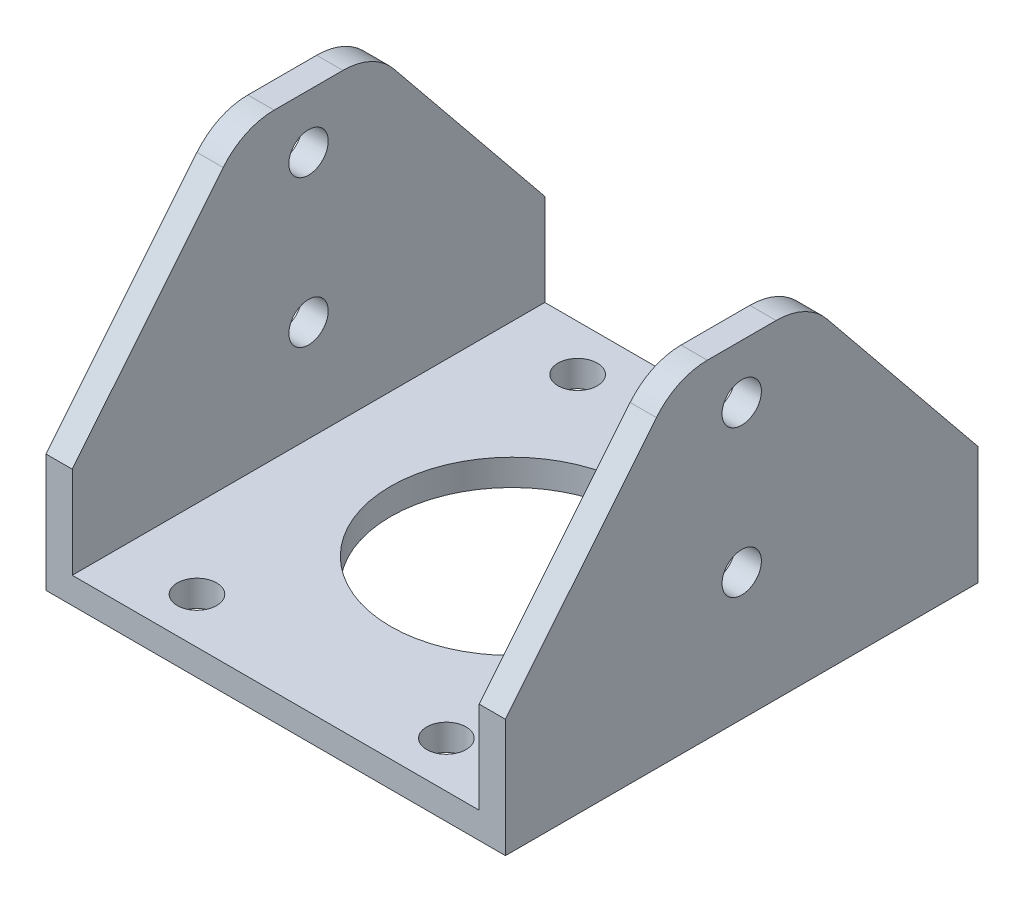
ISO-10303-21;
HEADER;
FILE_DESCRIPTION(('STEP AP214'),'2;1');
FILE_NAME('part.step','',(''),(''),'','','');
FILE_SCHEMA(('AUTOMOTIVE_DESIGN { 1 0 10303 214 1 1 1 1 }'));
ENDSEC;
DATA;
#1=APPLICATION_CONTEXT('core data for automotive mechanical design processes');
#2=APPLICATION_PROTOCOL_DEFINITION('international standard','automotive_design',2000,#1);
#3=PRODUCT_CONTEXT('',#1,'mechanical');
#4=PRODUCT('Part','Part','',(#3));
#5=PRODUCT_RELATED_PRODUCT_CATEGORY('part','',(#4));
#6=PRODUCT_DEFINITION_FORMATION('','',#4);
#7=PRODUCT_DEFINITION_CONTEXT('part definition',#1,'design');
#8=PRODUCT_DEFINITION('design','',#6,#7);
#9=PRODUCT_DEFINITION_SHAPE('','',#8);
#10=(LENGTH_UNIT() NAMED_UNIT(*) SI_UNIT(.MILLI.,.METRE.));
#11=(NAMED_UNIT(*) PLANE_ANGLE_UNIT() SI_UNIT($,.RADIAN.));
#12=(NAMED_UNIT(*) SI_UNIT($,.STERADIAN.) SOLID_ANGLE_UNIT());
#13=UNCERTAINTY_MEASURE_WITH_UNIT(LENGTH_MEASURE(1.E-05),#10,'distance_accuracy_value','');
#14=(GEOMETRIC_REPRESENTATION_CONTEXT(3) GLOBAL_UNCERTAINTY_ASSIGNED_CONTEXT((#13)) GLOBAL_UNIT_ASSIGNED_CONTEXT((#10,
#11,#12)) REPRESENTATION_CONTEXT('',''));
#15=CARTESIAN_POINT('',(0.,0.,0.));
#16=DIRECTION('',(0.,0.,1.));
#17=DIRECTION('',(1.,0.,0.));
#18=AXIS2_PLACEMENT_3D('',#15,#16,#17);
#19=CARTESIAN_POINT('',(35.,0.,36.));
#20=DIRECTION('',(0.,1.,0.));
#21=DIRECTION('',(-1.,0.,0.));
#22=AXIS2_PLACEMENT_3D('',#19,#20,#21);
#23=PLANE('',#22);
#24=CARTESIAN_POINT('',(27.,0.,3.5));
#25=DIRECTION('',(0.,1.,0.));
#26=DIRECTION('',(-1.,0.,0.));
#27=AXIS2_PLACEMENT_3D('',#24,#25,#26);
#28=CIRCLE('',#27,1.5);
#29=CARTESIAN_POINT('',(25.5,0.,3.5));
#30=VERTEX_POINT('',#29);
#31=EDGE_CURVE('E294',#30,#30,#28,.T.);
#32=ORIENTED_EDGE('',*,*,#31,.T.);
#33=EDGE_LOOP('',(#32));
#34=FACE_BOUND('',#33,.T.);
#35=CARTESIAN_POINT('',(8.00000000000001,0.,32.5));
#36=DIRECTION('',(0.,1.,0.));
#37=DIRECTION('',(-1.,0.,0.));
#38=AXIS2_PLACEMENT_3D('',#35,#36,#37);
#39=CIRCLE('',#38,1.5);
#40=CARTESIAN_POINT('',(6.5,0.,32.5));
#41=VERTEX_POINT('',#40);
#42=EDGE_CURVE('E291',#41,#41,#39,.T.);
#43=ORIENTED_EDGE('',*,*,#42,.T.);
#44=EDGE_LOOP('',(#43));
#45=FACE_BOUND('',#44,.T.);
#46=CARTESIAN_POINT('',(27.,0.,32.5));
#47=DIRECTION('',(0.,1.,0.));
#48=DIRECTION('',(-1.,0.,0.));
#49=AXIS2_PLACEMENT_3D('',#46,#47,#48);
#50=CIRCLE('',#49,1.5);
#51=CARTESIAN_POINT('',(25.5,0.,32.5));
#52=VERTEX_POINT('',#51);
#53=EDGE_CURVE('E288',#52,#52,#50,.T.);
#54=ORIENTED_EDGE('',*,*,#53,.T.);
#55=EDGE_LOOP('',(#54));
#56=FACE_BOUND('',#55,.T.);
#57=CARTESIAN_POINT('',(8.,0.,3.5));
#58=DIRECTION('',(0.,1.,0.));
#59=DIRECTION('',(-1.,0.,0.));
#60=AXIS2_PLACEMENT_3D('',#57,#58,#59);
#61=CIRCLE('',#60,1.5);
#62=CARTESIAN_POINT('',(6.5,0.,3.5));
#63=VERTEX_POINT('',#62);
#64=EDGE_CURVE('E285',#63,#63,#61,.T.);
#65=ORIENTED_EDGE('',*,*,#64,.T.);
#66=EDGE_LOOP('',(#65));
#67=FACE_BOUND('',#66,.T.);
#68=CARTESIAN_POINT('',(17.5,0.,18.));
#69=DIRECTION('',(0.,-1.,0.));
#70=DIRECTION('',(0.,0.,-1.));
#71=AXIS2_PLACEMENT_3D('',#68,#69,#70);
#72=CIRCLE('',#71,9.25);
#73=CARTESIAN_POINT('',(17.5,0.,8.75));
#74=VERTEX_POINT('',#73);
#75=EDGE_CURVE('E211',#74,#74,#72,.T.);
#76=ORIENTED_EDGE('',*,*,#75,.F.);
#77=EDGE_LOOP('',(#76));
#78=FACE_BOUND('',#77,.T.);
#79=DIRECTION('',(1.,0.,0.));
#80=VECTOR('',#79,1.);
#81=CARTESIAN_POINT('',(35.,0.,0.));
#82=LINE('',#81,#80);
#83=CARTESIAN_POINT('',(0.,0.,0.));
#84=VERTEX_POINT('',#83);
#85=CARTESIAN_POINT('',(35.,0.,0.));
#86=VERTEX_POINT('',#85);
#87=EDGE_CURVE('E176',#84,#86,#82,.T.);
#88=ORIENTED_EDGE('',*,*,#87,.T.);
#89=DIRECTION('',(0.,0.,-1.));
#90=VECTOR('',#89,1.);
#91=CARTESIAN_POINT('',(35.,0.,36.));
#92=LINE('',#91,#90);
#93=CARTESIAN_POINT('',(35.,0.,36.));
#94=VERTEX_POINT('',#93);
#95=EDGE_CURVE('E161',#94,#86,#92,.T.);
#96=ORIENTED_EDGE('',*,*,#95,.F.);
#97=DIRECTION('',(1.,0.,0.));
#98=VECTOR('',#97,1.);
#99=CARTESIAN_POINT('',(35.,0.,36.));
#100=LINE('',#99,#98);
#101=CARTESIAN_POINT('',(0.,0.,36.));
#102=VERTEX_POINT('',#101);
#103=EDGE_CURVE('E177',#102,#94,#100,.T.);
#104=ORIENTED_EDGE('',*,*,#103,.F.);
#105=DIRECTION('',(0.,0.,-1.));
#106=VECTOR('',#105,1.);
#107=CARTESIAN_POINT('',(0.,0.,36.));
#108=LINE('',#107,#106);
#109=EDGE_CURVE('E187',#102,#84,#108,.T.);
#110=ORIENTED_EDGE('',*,*,#109,.T.);
#111=EDGE_LOOP('',(#88,#96,#104,#110));
#112=FACE_BOUND('',#111,.T.);
#113=ADVANCED_FACE('F34',(#34,#45,#56,#67,#78,#112),#23,.F.);
#114=CARTESIAN_POINT('',(35.,25.,36.));
#115=DIRECTION('',(-1.,0.,0.));
#116=DIRECTION('',(0.,0.,1.));
#117=AXIS2_PLACEMENT_3D('',#114,#115,#116);
#118=PLANE('',#117);
#119=CARTESIAN_POINT('',(35.,20.9,18.));
#120=DIRECTION('',(-1.,0.,0.));
#121=DIRECTION('',(0.,0.,1.));
#122=AXIS2_PLACEMENT_3D('',#119,#120,#121);
#123=CIRCLE('',#122,1.5);
#124=CARTESIAN_POINT('',(35.,20.9,19.5));
#125=VERTEX_POINT('',#124);
#126=EDGE_CURVE('E318',#125,#125,#123,.T.);
#127=ORIENTED_EDGE('',*,*,#126,.T.);
#128=EDGE_LOOP('',(#127));
#129=FACE_BOUND('',#128,.T.);
#130=CARTESIAN_POINT('',(35.,9.7,18.));
#131=DIRECTION('',(-1.,0.,0.));
#132=DIRECTION('',(0.,0.,1.));
#133=AXIS2_PLACEMENT_3D('',#130,#131,#132);
#134=CIRCLE('',#133,1.5);
#135=CARTESIAN_POINT('',(35.,9.7,19.5));
#136=VERTEX_POINT('',#135);
#137=EDGE_CURVE('E309',#136,#136,#134,.T.);
#138=ORIENTED_EDGE('',*,*,#137,.T.);
#139=EDGE_LOOP('',(#138));
#140=FACE_BOUND('',#139,.T.);
#141=DIRECTION('',(0.,0.776114000116266,0.630592625094466));
#142=VECTOR('',#141,1.);
#143=CARTESIAN_POINT('',(35.,36.2564705882353,22.1458823529412));
#144=LINE('',#143,#142);
#145=CARTESIAN_POINT('',(35.,9.,0.));
#146=VERTEX_POINT('',#145);
#147=CARTESIAN_POINT('',(35.,23.1529631254723,11.4992825394463));
#148=VERTEX_POINT('',#147);
#149=EDGE_CURVE('E247',#146,#148,#144,.T.);
#150=ORIENTED_EDGE('',*,*,#149,.T.);
#151=CARTESIAN_POINT('',(35.,20.,15.3798525400276));
#152=DIRECTION('',(-1.,0.,0.));
#153=DIRECTION('',(0.,0.,1.));
#154=AXIS2_PLACEMENT_3D('',#151,#152,#153);
#155=CIRCLE('',#154,5.);
#156=CARTESIAN_POINT('',(35.,25.,15.3798525400276));
#157=VERTEX_POINT('',#156);
#158=EDGE_CURVE('E42',#148,#157,#155,.F.);
#159=ORIENTED_EDGE('',*,*,#158,.T.);
#160=DIRECTION('',(0.,0.,-1.));
#161=VECTOR('',#160,1.);
#162=CARTESIAN_POINT('',(35.,25.,36.));
#163=LINE('',#162,#161);
#164=CARTESIAN_POINT('',(35.,25.,20.6201474599724));
#165=VERTEX_POINT('',#164);
#166=EDGE_CURVE('E204',#165,#157,#163,.T.);
#167=ORIENTED_EDGE('',*,*,#166,.F.);
#168=CARTESIAN_POINT('',(35.,20.,20.6201474599724));
#169=DIRECTION('',(-1.,0.,0.));
#170=DIRECTION('',(0.,0.,1.));
#171=AXIS2_PLACEMENT_3D('',#168,#169,#170);
#172=CIRCLE('',#171,5.);
#173=CARTESIAN_POINT('',(35.,23.1529631254723,24.5007174605537));
#174=VERTEX_POINT('',#173);
#175=EDGE_CURVE('E49',#165,#174,#172,.F.);
#176=ORIENTED_EDGE('',*,*,#175,.T.);
#177=DIRECTION('',(0.,-0.776114000116266,0.630592625094466));
#178=VECTOR('',#177,1.);
#179=CARTESIAN_POINT('',(35.,18.6376470588235,28.1694117647059));
#180=LINE('',#179,#178);
#181=CARTESIAN_POINT('',(35.,9.00000000000001,36.));
#182=VERTEX_POINT('',#181);
#183=EDGE_CURVE('E271',#174,#182,#180,.T.);
#184=ORIENTED_EDGE('',*,*,#183,.T.);
#185=DIRECTION('',(0.,1.,0.));
#186=VECTOR('',#185,1.);
#187=CARTESIAN_POINT('',(35.,25.,36.));
#188=LINE('',#187,#186);
#189=EDGE_CURVE('E181',#94,#182,#188,.T.);
#190=ORIENTED_EDGE('',*,*,#189,.F.);
#191=ORIENTED_EDGE('',*,*,#95,.T.);
#192=DIRECTION('',(0.,1.,0.));
#193=VECTOR('',#192,1.);
#194=CARTESIAN_POINT('',(35.,25.,0.));
#195=LINE('',#194,#193);
#196=EDGE_CURVE('E334',#86,#146,#195,.T.);
#197=ORIENTED_EDGE('',*,*,#196,.T.);
#198=EDGE_LOOP('',(#150,#159,#167,#176,#184,#190,#191,#197));
#199=FACE_BOUND('',#198,.T.);
#200=ADVANCED_FACE('F245',(#129,#140,#199),#118,.F.);
#201=CARTESIAN_POINT('',(33.,25.,36.));
#202=DIRECTION('',(0.,-1.,0.));
#203=DIRECTION('',(0.,0.,-1.));
#204=AXIS2_PLACEMENT_3D('',#201,#202,#203);
#205=PLANE('',#204);
#206=ORIENTED_EDGE('',*,*,#166,.T.);
#207=DIRECTION('',(-1.,0.,0.));
#208=VECTOR('',#207,1.);
#209=CARTESIAN_POINT('',(33.,25.,15.3798525400276));
#210=LINE('',#209,#208);
#211=CARTESIAN_POINT('',(33.,25.,15.3798525400276));
#212=VERTEX_POINT('',#211);
#213=EDGE_CURVE('E236',#157,#212,#210,.T.);
#214=ORIENTED_EDGE('',*,*,#213,.T.);
#215=DIRECTION('',(0.,0.,-1.));
#216=VECTOR('',#215,1.);
#217=CARTESIAN_POINT('',(33.,25.,36.));
#218=LINE('',#217,#216);
#219=CARTESIAN_POINT('',(33.,25.,20.6201474599724));
#220=VERTEX_POINT('',#219);
#221=EDGE_CURVE('E201',#220,#212,#218,.T.);
#222=ORIENTED_EDGE('',*,*,#221,.F.);
#223=DIRECTION('',(-1.,0.,0.));
#224=VECTOR('',#223,1.);
#225=CARTESIAN_POINT('',(33.,25.,20.6201474599724));
#226=LINE('',#225,#224);
#227=EDGE_CURVE('E234',#220,#165,#226,.F.);
#228=ORIENTED_EDGE('',*,*,#227,.T.);
#229=EDGE_LOOP('',(#206,#214,#222,#228));
#230=FACE_BOUND('',#229,.T.);
#231=ADVANCED_FACE('F251',(#230),#205,.F.);
#232=CARTESIAN_POINT('',(33.,2.,36.));
#233=DIRECTION('',(1.,0.,0.));
#234=DIRECTION('',(0.,0.,-1.));
#235=AXIS2_PLACEMENT_3D('',#232,#233,#234);
#236=PLANE('',#235);
#237=CARTESIAN_POINT('',(33.,20.9,18.));
#238=DIRECTION('',(1.,0.,0.));
#239=DIRECTION('',(0.,0.,-1.));
#240=AXIS2_PLACEMENT_3D('',#237,#238,#239);
#241=CIRCLE('',#240,1.5);
#242=CARTESIAN_POINT('',(33.,20.9,16.5));
#243=VERTEX_POINT('',#242);
#244=EDGE_CURVE('E315',#243,#243,#241,.T.);
#245=ORIENTED_EDGE('',*,*,#244,.T.);
#246=EDGE_LOOP('',(#245));
#247=FACE_BOUND('',#246,.T.);
#248=CARTESIAN_POINT('',(33.,9.7,18.));
#249=DIRECTION('',(1.,0.,0.));
#250=DIRECTION('',(0.,0.,-1.));
#251=AXIS2_PLACEMENT_3D('',#248,#249,#250);
#252=CIRCLE('',#251,1.5);
#253=CARTESIAN_POINT('',(33.,9.7,16.5));
#254=VERTEX_POINT('',#253);
#255=EDGE_CURVE('E306',#254,#254,#252,.T.);
#256=ORIENTED_EDGE('',*,*,#255,.T.);
#257=EDGE_LOOP('',(#256));
#258=FACE_BOUND('',#257,.T.);
#259=ORIENTED_EDGE('',*,*,#221,.T.);
#260=CARTESIAN_POINT('',(33.,20.,15.3798525400276));
#261=DIRECTION('',(1.,0.,0.));
#262=DIRECTION('',(0.,0.,-1.));
#263=AXIS2_PLACEMENT_3D('',#260,#261,#262);
#264=CIRCLE('',#263,5.);
#265=CARTESIAN_POINT('',(33.,23.1529631254723,11.4992825394463));
#266=VERTEX_POINT('',#265);
#267=EDGE_CURVE('E241',#212,#266,#264,.F.);
#268=ORIENTED_EDGE('',*,*,#267,.T.);
#269=DIRECTION('',(0.,-0.776114000116266,-0.630592625094466));
#270=VECTOR('',#269,1.);
#271=CARTESIAN_POINT('',(33.,22.4023529411765,10.8894117647059));
#272=LINE('',#271,#270);
#273=CARTESIAN_POINT('',(33.,9.,0.));
#274=VERTEX_POINT('',#273);
#275=EDGE_CURVE('E257',#266,#274,#272,.T.);
#276=ORIENTED_EDGE('',*,*,#275,.T.);
#277=DIRECTION('',(0.,-1.,0.));
#278=VECTOR('',#277,1.);
#279=CARTESIAN_POINT('',(33.,2.,0.));
#280=LINE('',#279,#278);
#281=CARTESIAN_POINT('',(33.,2.,0.));
#282=VERTEX_POINT('',#281);
#283=EDGE_CURVE('E336',#274,#282,#280,.T.);
#284=ORIENTED_EDGE('',*,*,#283,.T.);
#285=DIRECTION('',(0.,0.,-1.));
#286=VECTOR('',#285,1.);
#287=CARTESIAN_POINT('',(33.,2.,36.));
#288=LINE('',#287,#286);
#289=CARTESIAN_POINT('',(33.,2.,36.));
#290=VERTEX_POINT('',#289);
#291=EDGE_CURVE('E198',#290,#282,#288,.T.);
#292=ORIENTED_EDGE('',*,*,#291,.F.);
#293=DIRECTION('',(0.,-1.,0.));
#294=VECTOR('',#293,1.);
#295=CARTESIAN_POINT('',(33.,2.,36.));
#296=LINE('',#295,#294);
#297=CARTESIAN_POINT('',(33.,9.00000000000001,36.));
#298=VERTEX_POINT('',#297);
#299=EDGE_CURVE('E325',#298,#290,#296,.T.);
#300=ORIENTED_EDGE('',*,*,#299,.F.);
#301=DIRECTION('',(0.,0.776114000116266,-0.630592625094466));
#302=VECTOR('',#301,1.);
#303=CARTESIAN_POINT('',(33.,4.78352941176471,39.4258823529412));
#304=LINE('',#303,#302);
#305=CARTESIAN_POINT('',(33.,23.1529631254723,24.5007174605537));
#306=VERTEX_POINT('',#305);
#307=EDGE_CURVE('E268',#298,#306,#304,.T.);
#308=ORIENTED_EDGE('',*,*,#307,.T.);
#309=CARTESIAN_POINT('',(33.,20.,20.6201474599724));
#310=DIRECTION('',(1.,0.,0.));
#311=DIRECTION('',(0.,0.,-1.));
#312=AXIS2_PLACEMENT_3D('',#309,#310,#311);
#313=CIRCLE('',#312,5.);
#314=EDGE_CURVE('E239',#306,#220,#313,.F.);
#315=ORIENTED_EDGE('',*,*,#314,.T.);
#316=EDGE_LOOP('',(#259,#268,#276,#284,#292,#300,#308,#315));
#317=FACE_BOUND('',#316,.T.);
#318=ADVANCED_FACE('F256',(#247,#258,#317),#236,.F.);
#319=CARTESIAN_POINT('',(2.,2.,36.));
#320=DIRECTION('',(0.,-1.,0.));
#321=DIRECTION('',(0.,0.,-1.));
#322=AXIS2_PLACEMENT_3D('',#319,#320,#321);
#323=PLANE('',#322);
#324=CARTESIAN_POINT('',(27.,2.,3.5));
#325=DIRECTION('',(0.,1.,0.));
#326=DIRECTION('',(-1.,0.,0.));
#327=AXIS2_PLACEMENT_3D('',#324,#325,#326);
#328=CIRCLE('',#327,1.5);
#329=CARTESIAN_POINT('',(25.5,2.,3.5));
#330=VERTEX_POINT('',#329);
#331=EDGE_CURVE('E277',#330,#330,#328,.T.);
#332=ORIENTED_EDGE('',*,*,#331,.F.);
#333=EDGE_LOOP('',(#332));
#334=FACE_BOUND('',#333,.T.);
#335=CARTESIAN_POINT('',(8.00000000000001,2.,32.5));
#336=DIRECTION('',(0.,1.,0.));
#337=DIRECTION('',(-1.,0.,0.));
#338=AXIS2_PLACEMENT_3D('',#335,#336,#337);
#339=CIRCLE('',#338,1.5);
#340=CARTESIAN_POINT('',(6.5,2.,32.5));
#341=VERTEX_POINT('',#340);
#342=EDGE_CURVE('E276',#341,#341,#339,.T.);
#343=ORIENTED_EDGE('',*,*,#342,.F.);
#344=EDGE_LOOP('',(#343));
#345=FACE_BOUND('',#344,.T.);
#346=CARTESIAN_POINT('',(27.,2.,32.5));
#347=DIRECTION('',(0.,1.,0.));
#348=DIRECTION('',(-1.,0.,0.));
#349=AXIS2_PLACEMENT_3D('',#346,#347,#348);
#350=CIRCLE('',#349,1.5);
#351=CARTESIAN_POINT('',(25.5,2.,32.5));
#352=VERTEX_POINT('',#351);
#353=EDGE_CURVE('E273',#352,#352,#350,.T.);
#354=ORIENTED_EDGE('',*,*,#353,.F.);
#355=EDGE_LOOP('',(#354));
#356=FACE_BOUND('',#355,.T.);
#357=CARTESIAN_POINT('',(8.,2.,3.5));
#358=DIRECTION('',(0.,1.,0.));
#359=DIRECTION('',(-1.,0.,0.));
#360=AXIS2_PLACEMENT_3D('',#357,#358,#359);
#361=CIRCLE('',#360,1.5);
#362=CARTESIAN_POINT('',(6.5,2.,3.5));
#363=VERTEX_POINT('',#362);
#364=EDGE_CURVE('E280',#363,#363,#361,.T.);
#365=ORIENTED_EDGE('',*,*,#364,.F.);
#366=EDGE_LOOP('',(#365));
#367=FACE_BOUND('',#366,.T.);
#368=CARTESIAN_POINT('',(17.5,2.,18.));
#369=DIRECTION('',(0.,-1.,0.));
#370=DIRECTION('',(0.,0.,-1.));
#371=AXIS2_PLACEMENT_3D('',#368,#369,#370);
#372=CIRCLE('',#371,9.25);
#373=CARTESIAN_POINT('',(17.5,2.,8.75));
#374=VERTEX_POINT('',#373);
#375=EDGE_CURVE('E209',#374,#374,#372,.T.);
#376=ORIENTED_EDGE('',*,*,#375,.T.);
#377=EDGE_LOOP('',(#376));
#378=FACE_BOUND('',#377,.T.);
#379=DIRECTION('',(-1.,0.,0.));
#380=VECTOR('',#379,1.);
#381=CARTESIAN_POINT('',(2.,2.,0.));
#382=LINE('',#381,#380);
#383=CARTESIAN_POINT('',(2.,2.,0.));
#384=VERTEX_POINT('',#383);
#385=EDGE_CURVE('E183',#282,#384,#382,.T.);
#386=ORIENTED_EDGE('',*,*,#385,.T.);
#387=DIRECTION('',(0.,0.,-1.));
#388=VECTOR('',#387,1.);
#389=CARTESIAN_POINT('',(2.,2.,36.));
#390=LINE('',#389,#388);
#391=CARTESIAN_POINT('',(2.,2.,36.));
#392=VERTEX_POINT('',#391);
#393=EDGE_CURVE('E195',#392,#384,#390,.T.);
#394=ORIENTED_EDGE('',*,*,#393,.F.);
#395=DIRECTION('',(-1.,0.,0.));
#396=VECTOR('',#395,1.);
#397=CARTESIAN_POINT('',(2.,2.,36.));
#398=LINE('',#397,#396);
#399=EDGE_CURVE('E327',#290,#392,#398,.T.);
#400=ORIENTED_EDGE('',*,*,#399,.F.);
#401=ORIENTED_EDGE('',*,*,#291,.T.);
#402=EDGE_LOOP('',(#386,#394,#400,#401));
#403=FACE_BOUND('',#402,.T.);
#404=ADVANCED_FACE('F340',(#334,#345,#356,#367,#378,#403),#323,.F.);
#405=CARTESIAN_POINT('',(2.,25.,36.));
#406=DIRECTION('',(-1.,0.,0.));
#407=DIRECTION('',(0.,-1.,0.));
#408=AXIS2_PLACEMENT_3D('',#405,#406,#407);
#409=PLANE('',#408);
#410=CARTESIAN_POINT('',(2.,20.9,18.));
#411=DIRECTION('',(-1.,0.,0.));
#412=DIRECTION('',(0.,-1.,0.));
#413=AXIS2_PLACEMENT_3D('',#410,#411,#412);
#414=CIRCLE('',#413,1.5);
#415=CARTESIAN_POINT('',(2.,19.4,18.));
#416=VERTEX_POINT('',#415);
#417=EDGE_CURVE('E312',#416,#416,#414,.T.);
#418=ORIENTED_EDGE('',*,*,#417,.T.);
#419=EDGE_LOOP('',(#418));
#420=FACE_BOUND('',#419,.T.);
#421=CARTESIAN_POINT('',(2.,9.7,18.));
#422=DIRECTION('',(-1.,0.,0.));
#423=DIRECTION('',(0.,-1.,0.));
#424=AXIS2_PLACEMENT_3D('',#421,#422,#423);
#425=CIRCLE('',#424,1.5);
#426=CARTESIAN_POINT('',(2.,8.2,18.));
#427=VERTEX_POINT('',#426);
#428=EDGE_CURVE('E301',#427,#427,#425,.T.);
#429=ORIENTED_EDGE('',*,*,#428,.T.);
#430=EDGE_LOOP('',(#429));
#431=FACE_BOUND('',#430,.T.);
#432=DIRECTION('',(0.,0.776114000116266,0.630592625094466));
#433=VECTOR('',#432,1.);
#434=CARTESIAN_POINT('',(2.,36.2564705882353,22.1458823529412));
#435=LINE('',#434,#433);
#436=CARTESIAN_POINT('',(2.,9.,0.));
#437=VERTEX_POINT('',#436);
#438=CARTESIAN_POINT('',(2.,23.1529631254723,11.4992825394463));
#439=VERTEX_POINT('',#438);
#440=EDGE_CURVE('E155',#437,#439,#435,.T.);
#441=ORIENTED_EDGE('',*,*,#440,.T.);
#442=CARTESIAN_POINT('',(2.,20.,15.3798525400276));
#443=DIRECTION('',(-1.,0.,0.));
#444=DIRECTION('',(0.,-1.,0.));
#445=AXIS2_PLACEMENT_3D('',#442,#443,#444);
#446=CIRCLE('',#445,5.);
#447=CARTESIAN_POINT('',(2.,25.,15.3798525400276));
#448=VERTEX_POINT('',#447);
#449=EDGE_CURVE('E229',#439,#448,#446,.F.);
#450=ORIENTED_EDGE('',*,*,#449,.T.);
#451=DIRECTION('',(0.,0.,-1.));
#452=VECTOR('',#451,1.);
#453=CARTESIAN_POINT('',(2.,25.,36.));
#454=LINE('',#453,#452);
#455=CARTESIAN_POINT('',(2.,25.,20.6201474599724));
#456=VERTEX_POINT('',#455);
#457=EDGE_CURVE('E192',#456,#448,#454,.T.);
#458=ORIENTED_EDGE('',*,*,#457,.F.);
#459=CARTESIAN_POINT('',(2.,20.,20.6201474599724));
#460=DIRECTION('',(-1.,0.,0.));
#461=DIRECTION('',(0.,-1.,0.));
#462=AXIS2_PLACEMENT_3D('',#459,#460,#461);
#463=CIRCLE('',#462,5.);
#464=CARTESIAN_POINT('',(2.,23.1529631254723,24.5007174605537));
#465=VERTEX_POINT('',#464);
#466=EDGE_CURVE('E227',#456,#465,#463,.F.);
#467=ORIENTED_EDGE('',*,*,#466,.T.);
#468=DIRECTION('',(0.,-0.776114000116266,0.630592625094466));
#469=VECTOR('',#468,1.);
#470=CARTESIAN_POINT('',(2.,18.6376470588235,28.1694117647059));
#471=LINE('',#470,#469);
#472=CARTESIAN_POINT('',(2.,9.00000000000001,36.));
#473=VERTEX_POINT('',#472);
#474=EDGE_CURVE('E262',#465,#473,#471,.T.);
#475=ORIENTED_EDGE('',*,*,#474,.T.);
#476=DIRECTION('',(0.,1.,0.));
#477=VECTOR('',#476,1.);
#478=CARTESIAN_POINT('',(2.,25.,36.));
#479=LINE('',#478,#477);
#480=EDGE_CURVE('E329',#392,#473,#479,.T.);
#481=ORIENTED_EDGE('',*,*,#480,.F.);
#482=ORIENTED_EDGE('',*,*,#393,.T.);
#483=DIRECTION('',(0.,1.,0.));
#484=VECTOR('',#483,1.);
#485=CARTESIAN_POINT('',(2.,25.,0.));
#486=LINE('',#485,#484);
#487=EDGE_CURVE('E178',#384,#437,#486,.T.);
#488=ORIENTED_EDGE('',*,*,#487,.T.);
#489=EDGE_LOOP('',(#441,#450,#458,#467,#475,#481,#482,#488));
#490=FACE_BOUND('',#489,.T.);
#491=ADVANCED_FACE('F345',(#420,#431,#490),#409,.F.);
#492=CARTESIAN_POINT('',(0.,25.,36.));
#493=DIRECTION('',(0.,-1.,0.));
#494=DIRECTION('',(0.,0.,-1.));
#495=AXIS2_PLACEMENT_3D('',#492,#493,#494);
#496=PLANE('',#495);
#497=ORIENTED_EDGE('',*,*,#457,.T.);
#498=DIRECTION('',(-1.,0.,0.));
#499=VECTOR('',#498,1.);
#500=CARTESIAN_POINT('',(0.,25.,15.3798525400276));
#501=LINE('',#500,#499);
#502=CARTESIAN_POINT('',(0.,25.,15.3798525400276));
#503=VERTEX_POINT('',#502);
#504=EDGE_CURVE('E219',#448,#503,#501,.T.);
#505=ORIENTED_EDGE('',*,*,#504,.T.);
#506=DIRECTION('',(0.,0.,-1.));
#507=VECTOR('',#506,1.);
#508=CARTESIAN_POINT('',(0.,25.,36.));
#509=LINE('',#508,#507);
#510=CARTESIAN_POINT('',(0.,25.,20.6201474599724));
#511=VERTEX_POINT('',#510);
#512=EDGE_CURVE('E189',#511,#503,#509,.T.);
#513=ORIENTED_EDGE('',*,*,#512,.F.);
#514=DIRECTION('',(-1.,0.,0.));
#515=VECTOR('',#514,1.);
#516=CARTESIAN_POINT('',(0.,25.,20.6201474599724));
#517=LINE('',#516,#515);
#518=EDGE_CURVE('E217',#511,#456,#517,.F.);
#519=ORIENTED_EDGE('',*,*,#518,.T.);
#520=EDGE_LOOP('',(#497,#505,#513,#519));
#521=FACE_BOUND('',#520,.T.);
#522=ADVANCED_FACE('F368',(#521),#496,.F.);
#523=CARTESIAN_POINT('',(0.,0.,36.));
#524=DIRECTION('',(1.,0.,0.));
#525=DIRECTION('',(0.,0.,-1.));
#526=AXIS2_PLACEMENT_3D('',#523,#524,#525);
#527=PLANE('',#526);
#528=CARTESIAN_POINT('',(0.,20.9,18.));
#529=DIRECTION('',(-1.,0.,0.));
#530=DIRECTION('',(0.,0.,1.));
#531=AXIS2_PLACEMENT_3D('',#528,#529,#530);
#532=CIRCLE('',#531,1.5);
#533=CARTESIAN_POINT('',(0.,20.9,19.5));
#534=VERTEX_POINT('',#533);
#535=EDGE_CURVE('E298',#534,#534,#532,.T.);
#536=ORIENTED_EDGE('',*,*,#535,.F.);
#537=EDGE_LOOP('',(#536));
#538=FACE_BOUND('',#537,.T.);
#539=CARTESIAN_POINT('',(0.,9.7,18.));
#540=DIRECTION('',(-1.,0.,0.));
#541=DIRECTION('',(0.,0.,1.));
#542=AXIS2_PLACEMENT_3D('',#539,#540,#541);
#543=CIRCLE('',#542,1.5);
#544=CARTESIAN_POINT('',(0.,9.7,19.5));
#545=VERTEX_POINT('',#544);
#546=EDGE_CURVE('E297',#545,#545,#543,.T.);
#547=ORIENTED_EDGE('',*,*,#546,.F.);
#548=EDGE_LOOP('',(#547));
#549=FACE_BOUND('',#548,.T.);
#550=ORIENTED_EDGE('',*,*,#512,.T.);
#551=CARTESIAN_POINT('',(0.,20.,15.3798525400276));
#552=DIRECTION('',(1.,0.,0.));
#553=DIRECTION('',(0.,0.,-1.));
#554=AXIS2_PLACEMENT_3D('',#551,#552,#553);
#555=CIRCLE('',#554,5.);
#556=CARTESIAN_POINT('',(0.,23.1529631254723,11.4992825394463));
#557=VERTEX_POINT('',#556);
#558=EDGE_CURVE('E169',#503,#557,#555,.F.);
#559=ORIENTED_EDGE('',*,*,#558,.T.);
#560=DIRECTION('',(0.,0.776114000116266,0.630592625094466));
#561=VECTOR('',#560,1.);
#562=CARTESIAN_POINT('',(0.,9.,0.));
#563=LINE('',#562,#561);
#564=CARTESIAN_POINT('',(0.,9.,0.));
#565=VERTEX_POINT('',#564);
#566=EDGE_CURVE('E152',#565,#557,#563,.T.);
#567=ORIENTED_EDGE('',*,*,#566,.F.);
#568=DIRECTION('',(0.,-1.,0.));
#569=VECTOR('',#568,1.);
#570=CARTESIAN_POINT('',(0.,0.,0.));
#571=LINE('',#570,#569);
#572=EDGE_CURVE('E167',#565,#84,#571,.T.);
#573=ORIENTED_EDGE('',*,*,#572,.T.);
#574=ORIENTED_EDGE('',*,*,#109,.F.);
#575=DIRECTION('',(0.,-1.,0.));
#576=VECTOR('',#575,1.);
#577=CARTESIAN_POINT('',(0.,0.,36.));
#578=LINE('',#577,#576);
#579=CARTESIAN_POINT('',(0.,9.00000000000001,36.));
#580=VERTEX_POINT('',#579);
#581=EDGE_CURVE('E190',#580,#102,#578,.T.);
#582=ORIENTED_EDGE('',*,*,#581,.F.);
#583=DIRECTION('',(0.,-0.776114000116265,0.630592625094466));
#584=VECTOR('',#583,1.);
#585=CARTESIAN_POINT('',(0.,9.00000000000001,36.));
#586=LINE('',#585,#584);
#587=CARTESIAN_POINT('',(0.,23.1529631254723,24.5007174605537));
#588=VERTEX_POINT('',#587);
#589=EDGE_CURVE('E170',#588,#580,#586,.T.);
#590=ORIENTED_EDGE('',*,*,#589,.F.);
#591=CARTESIAN_POINT('',(0.,20.,20.6201474599724));
#592=DIRECTION('',(1.,0.,0.));
#593=DIRECTION('',(0.,0.,-1.));
#594=AXIS2_PLACEMENT_3D('',#591,#592,#593);
#595=CIRCLE('',#594,5.);
#596=EDGE_CURVE('E222',#588,#511,#595,.F.);
#597=ORIENTED_EDGE('',*,*,#596,.T.);
#598=EDGE_LOOP('',(#550,#559,#567,#573,#574,#582,#590,#597));
#599=FACE_BOUND('',#598,.T.);
#600=ADVANCED_FACE('F165',(#538,#549,#599),#527,.F.);
#601=CARTESIAN_POINT('',(0.,0.,36.));
#602=DIRECTION('',(0.,0.,-1.));
#603=DIRECTION('',(-1.,0.,0.));
#604=AXIS2_PLACEMENT_3D('',#601,#602,#603);
#605=PLANE('',#604);
#606=ORIENTED_EDGE('',*,*,#189,.T.);
#607=DIRECTION('',(-1.,0.,0.));
#608=VECTOR('',#607,1.);
#609=CARTESIAN_POINT('',(0.,9.00000000000001,36.));
#610=LINE('',#609,#608);
#611=EDGE_CURVE('E216',#182,#298,#610,.T.);
#612=ORIENTED_EDGE('',*,*,#611,.T.);
#613=ORIENTED_EDGE('',*,*,#299,.T.);
#614=ORIENTED_EDGE('',*,*,#399,.T.);
#615=ORIENTED_EDGE('',*,*,#480,.T.);
#616=EDGE_CURVE('E213',#473,#580,#610,.T.);
#617=ORIENTED_EDGE('',*,*,#616,.T.);
#618=ORIENTED_EDGE('',*,*,#581,.T.);
#619=ORIENTED_EDGE('',*,*,#103,.T.);
#620=EDGE_LOOP('',(#606,#612,#613,#614,#615,#617,#618,#619));
#621=FACE_BOUND('',#620,.T.);
#622=ADVANCED_FACE('F349',(#621),#605,.F.);
#623=CARTESIAN_POINT('',(0.,0.,0.));
#624=DIRECTION('',(0.,0.,-1.));
#625=DIRECTION('',(-1.,0.,0.));
#626=AXIS2_PLACEMENT_3D('',#623,#624,#625);
#627=PLANE('',#626);
#628=DIRECTION('',(-1.,0.,0.));
#629=VECTOR('',#628,1.);
#630=CARTESIAN_POINT('',(0.,9.,0.));
#631=LINE('',#630,#629);
#632=EDGE_CURVE('E160',#146,#274,#631,.T.);
#633=ORIENTED_EDGE('',*,*,#632,.F.);
#634=ORIENTED_EDGE('',*,*,#196,.F.);
#635=ORIENTED_EDGE('',*,*,#87,.F.);
#636=ORIENTED_EDGE('',*,*,#572,.F.);
#637=EDGE_CURVE('E149',#437,#565,#631,.T.);
#638=ORIENTED_EDGE('',*,*,#637,.F.);
#639=ORIENTED_EDGE('',*,*,#487,.F.);
#640=ORIENTED_EDGE('',*,*,#385,.F.);
#641=ORIENTED_EDGE('',*,*,#283,.F.);
#642=EDGE_LOOP('',(#633,#634,#635,#636,#638,#639,#640,#641));
#643=FACE_BOUND('',#642,.T.);
#644=ADVANCED_FACE('F174',(#643),#627,.T.);
#645=CARTESIAN_POINT('',(17.5,12.,18.));
#646=DIRECTION('',(0.,-1.,0.));
#647=DIRECTION('',(0.,0.,-1.));
#648=AXIS2_PLACEMENT_3D('',#645,#646,#647);
#649=CYLINDRICAL_SURFACE('',#648,9.25);
#650=ORIENTED_EDGE('',*,*,#75,.T.);
#651=EDGE_LOOP('',(#650));
#652=FACE_BOUND('',#651,.T.);
#653=ORIENTED_EDGE('',*,*,#375,.F.);
#654=EDGE_LOOP('',(#653));
#655=FACE_BOUND('',#654,.T.);
#656=ADVANCED_FACE('F411',(#652,#655),#649,.F.);
#657=CARTESIAN_POINT('',(54.,9.7,18.));
#658=DIRECTION('',(-1.,0.,0.));
#659=DIRECTION('',(0.,0.,1.));
#660=AXIS2_PLACEMENT_3D('',#657,#658,#659);
#661=CYLINDRICAL_SURFACE('',#660,1.5);
#662=ORIENTED_EDGE('',*,*,#546,.T.);
#663=EDGE_LOOP('',(#662));
#664=FACE_BOUND('',#663,.T.);
#665=ORIENTED_EDGE('',*,*,#428,.F.);
#666=EDGE_LOOP('',(#665));
#667=FACE_BOUND('',#666,.T.);
#668=ADVANCED_FACE('F416',(#664,#667),#661,.F.);
#669=CARTESIAN_POINT('',(54.,20.9,18.));
#670=DIRECTION('',(-1.,0.,0.));
#671=DIRECTION('',(0.,0.,1.));
#672=AXIS2_PLACEMENT_3D('',#669,#670,#671);
#673=CYLINDRICAL_SURFACE('',#672,1.5);
#674=ORIENTED_EDGE('',*,*,#535,.T.);
#675=EDGE_LOOP('',(#674));
#676=FACE_BOUND('',#675,.T.);
#677=ORIENTED_EDGE('',*,*,#417,.F.);
#678=EDGE_LOOP('',(#677));
#679=FACE_BOUND('',#678,.T.);
#680=ADVANCED_FACE('F422',(#676,#679),#673,.F.);
#681=ORIENTED_EDGE('',*,*,#255,.F.);
#682=EDGE_LOOP('',(#681));
#683=FACE_BOUND('',#682,.T.);
#684=ORIENTED_EDGE('',*,*,#137,.F.);
#685=EDGE_LOOP('',(#684));
#686=FACE_BOUND('',#685,.T.);
#687=ADVANCED_FACE('F418',(#683,#686),#661,.F.);
#688=ORIENTED_EDGE('',*,*,#244,.F.);
#689=EDGE_LOOP('',(#688));
#690=FACE_BOUND('',#689,.T.);
#691=ORIENTED_EDGE('',*,*,#126,.F.);
#692=EDGE_LOOP('',(#691));
#693=FACE_BOUND('',#692,.T.);
#694=ADVANCED_FACE('F421',(#690,#693),#673,.F.);
#695=CARTESIAN_POINT('',(8.,-8.,3.5));
#696=DIRECTION('',(0.,1.,0.));
#697=DIRECTION('',(-1.,0.,0.));
#698=AXIS2_PLACEMENT_3D('',#695,#696,#697);
#699=CYLINDRICAL_SURFACE('',#698,1.5);
#700=ORIENTED_EDGE('',*,*,#364,.T.);
#701=EDGE_LOOP('',(#700));
#702=FACE_BOUND('',#701,.T.);
#703=ORIENTED_EDGE('',*,*,#64,.F.);
#704=EDGE_LOOP('',(#703));
#705=FACE_BOUND('',#704,.T.);
#706=ADVANCED_FACE('F426',(#702,#705),#699,.F.);
#707=CARTESIAN_POINT('',(27.,-8.,32.5));
#708=DIRECTION('',(0.,1.,0.));
#709=DIRECTION('',(-1.,0.,0.));
#710=AXIS2_PLACEMENT_3D('',#707,#708,#709);
#711=CYLINDRICAL_SURFACE('',#710,1.5);
#712=ORIENTED_EDGE('',*,*,#353,.T.);
#713=EDGE_LOOP('',(#712));
#714=FACE_BOUND('',#713,.T.);
#715=ORIENTED_EDGE('',*,*,#53,.F.);
#716=EDGE_LOOP('',(#715));
#717=FACE_BOUND('',#716,.T.);
#718=ADVANCED_FACE('F430',(#714,#717),#711,.F.);
#719=CARTESIAN_POINT('',(8.00000000000001,-8.,32.5));
#720=DIRECTION('',(0.,1.,0.));
#721=DIRECTION('',(-1.,0.,0.));
#722=AXIS2_PLACEMENT_3D('',#719,#720,#721);
#723=CYLINDRICAL_SURFACE('',#722,1.5);
#724=ORIENTED_EDGE('',*,*,#342,.T.);
#725=EDGE_LOOP('',(#724));
#726=FACE_BOUND('',#725,.T.);
#727=ORIENTED_EDGE('',*,*,#42,.F.);
#728=EDGE_LOOP('',(#727));
#729=FACE_BOUND('',#728,.T.);
#730=ADVANCED_FACE('F432',(#726,#729),#723,.F.);
#731=CARTESIAN_POINT('',(27.,-8.,3.5));
#732=DIRECTION('',(0.,1.,0.));
#733=DIRECTION('',(-1.,0.,0.));
#734=AXIS2_PLACEMENT_3D('',#731,#732,#733);
#735=CYLINDRICAL_SURFACE('',#734,1.5);
#736=ORIENTED_EDGE('',*,*,#331,.T.);
#737=EDGE_LOOP('',(#736));
#738=FACE_BOUND('',#737,.T.);
#739=ORIENTED_EDGE('',*,*,#31,.F.);
#740=EDGE_LOOP('',(#739));
#741=FACE_BOUND('',#740,.T.);
#742=ADVANCED_FACE('F435',(#738,#741),#735,.F.);
#743=CARTESIAN_POINT('',(57.,9.,0.));
#744=DIRECTION('',(0.,-0.630592625094465,0.776114000116266));
#745=DIRECTION('',(0.,-0.776114000116266,-0.630592625094466));
#746=AXIS2_PLACEMENT_3D('',#743,#744,#745);
#747=PLANE('',#746);
#748=ORIENTED_EDGE('',*,*,#566,.T.);
#749=DIRECTION('',(-1.,0.,0.));
#750=VECTOR('',#749,1.);
#751=CARTESIAN_POINT('',(57.,23.1529631254723,11.4992825394463));
#752=LINE('',#751,#750);
#753=EDGE_CURVE('E225',#557,#439,#752,.F.);
#754=ORIENTED_EDGE('',*,*,#753,.T.);
#755=ORIENTED_EDGE('',*,*,#440,.F.);
#756=ORIENTED_EDGE('',*,*,#637,.T.);
#757=EDGE_LOOP('',(#748,#754,#755,#756));
#758=FACE_BOUND('',#757,.T.);
#759=ADVANCED_FACE('F151',(#758),#747,.F.);
#760=ORIENTED_EDGE('',*,*,#275,.F.);
#761=DIRECTION('',(-1.,0.,0.));
#762=VECTOR('',#761,1.);
#763=CARTESIAN_POINT('',(57.,23.1529631254723,11.4992825394463));
#764=LINE('',#763,#762);
#765=EDGE_CURVE('E57',#266,#148,#764,.F.);
#766=ORIENTED_EDGE('',*,*,#765,.T.);
#767=ORIENTED_EDGE('',*,*,#149,.F.);
#768=ORIENTED_EDGE('',*,*,#632,.T.);
#769=EDGE_LOOP('',(#760,#766,#767,#768));
#770=FACE_BOUND('',#769,.T.);
#771=ADVANCED_FACE('F259',(#770),#747,.F.);
#772=CARTESIAN_POINT('',(57.,9.00000000000001,36.));
#773=DIRECTION('',(0.,-0.630592625094466,-0.776114000116265));
#774=DIRECTION('',(0.,0.776114000116266,-0.630592625094466));
#775=AXIS2_PLACEMENT_3D('',#772,#773,#774);
#776=PLANE('',#775);
#777=ORIENTED_EDGE('',*,*,#474,.F.);
#778=DIRECTION('',(-1.,0.,0.));
#779=VECTOR('',#778,1.);
#780=CARTESIAN_POINT('',(57.,23.1529631254723,24.5007174605537));
#781=LINE('',#780,#779);
#782=EDGE_CURVE('E231',#465,#588,#781,.T.);
#783=ORIENTED_EDGE('',*,*,#782,.T.);
#784=ORIENTED_EDGE('',*,*,#589,.T.);
#785=ORIENTED_EDGE('',*,*,#616,.F.);
#786=EDGE_LOOP('',(#777,#783,#784,#785));
#787=FACE_BOUND('',#786,.T.);
#788=ADVANCED_FACE('F360',(#787),#776,.F.);
#789=ORIENTED_EDGE('',*,*,#183,.F.);
#790=DIRECTION('',(-1.,0.,0.));
#791=VECTOR('',#790,1.);
#792=CARTESIAN_POINT('',(57.,23.1529631254723,24.5007174605537));
#793=LINE('',#792,#791);
#794=EDGE_CURVE('E11',#174,#306,#793,.T.);
#795=ORIENTED_EDGE('',*,*,#794,.T.);
#796=ORIENTED_EDGE('',*,*,#307,.F.);
#797=ORIENTED_EDGE('',*,*,#611,.F.);
#798=EDGE_LOOP('',(#789,#795,#796,#797));
#799=FACE_BOUND('',#798,.T.);
#800=ADVANCED_FACE('F374',(#799),#776,.F.);
#801=CARTESIAN_POINT('',(0.,20.,15.3798525400276));
#802=DIRECTION('',(-1.,0.,0.));
#803=DIRECTION('',(0.,0.,1.));
#804=AXIS2_PLACEMENT_3D('',#801,#802,#803);
#805=CYLINDRICAL_SURFACE('',#804,5.);
#806=ORIENTED_EDGE('',*,*,#449,.F.);
#807=ORIENTED_EDGE('',*,*,#753,.F.);
#808=ORIENTED_EDGE('',*,*,#558,.F.);
#809=ORIENTED_EDGE('',*,*,#504,.F.);
#810=EDGE_LOOP('',(#806,#807,#808,#809));
#811=FACE_BOUND('',#810,.T.);
#812=ADVANCED_FACE('F372',(#811),#805,.T.);
#813=CARTESIAN_POINT('',(57.,20.,20.6201474599724));
#814=DIRECTION('',(-1.,0.,0.));
#815=DIRECTION('',(0.,0.,1.));
#816=AXIS2_PLACEMENT_3D('',#813,#814,#815);
#817=CYLINDRICAL_SURFACE('',#816,5.);
#818=ORIENTED_EDGE('',*,*,#466,.F.);
#819=ORIENTED_EDGE('',*,*,#518,.F.);
#820=ORIENTED_EDGE('',*,*,#596,.F.);
#821=ORIENTED_EDGE('',*,*,#782,.F.);
#822=EDGE_LOOP('',(#818,#819,#820,#821));
#823=FACE_BOUND('',#822,.T.);
#824=ADVANCED_FACE('F364',(#823),#817,.T.);
#825=CARTESIAN_POINT('',(33.,20.,15.3798525400276));
#826=DIRECTION('',(-1.,0.,0.));
#827=DIRECTION('',(0.,0.,1.));
#828=AXIS2_PLACEMENT_3D('',#825,#826,#827);
#829=CYLINDRICAL_SURFACE('',#828,5.);
#830=ORIENTED_EDGE('',*,*,#158,.F.);
#831=ORIENTED_EDGE('',*,*,#765,.F.);
#832=ORIENTED_EDGE('',*,*,#267,.F.);
#833=ORIENTED_EDGE('',*,*,#213,.F.);
#834=EDGE_LOOP('',(#830,#831,#832,#833));
#835=FACE_BOUND('',#834,.T.);
#836=ADVANCED_FACE('F254',(#835),#829,.T.);
#837=CARTESIAN_POINT('',(57.,20.,20.6201474599724));
#838=DIRECTION('',(-1.,0.,0.));
#839=DIRECTION('',(0.,0.,1.));
#840=AXIS2_PLACEMENT_3D('',#837,#838,#839);
#841=CYLINDRICAL_SURFACE('',#840,5.);
#842=ORIENTED_EDGE('',*,*,#175,.F.);
#843=ORIENTED_EDGE('',*,*,#227,.F.);
#844=ORIENTED_EDGE('',*,*,#314,.F.);
#845=ORIENTED_EDGE('',*,*,#794,.F.);
#846=EDGE_LOOP('',(#842,#843,#844,#845));
#847=FACE_BOUND('',#846,.T.);
#848=ADVANCED_FACE('F36',(#847),#841,.T.);
#849=CLOSED_SHELL('',(#113,#200,#231,#318,#404,#491,#522,#600,#622,#644,#656,#668,#680,#687,
#694,#706,#718,#730,#742,#759,#771,#788,#800,#812,#824,#836,#848));
#850=MANIFOLD_SOLID_BREP('B2',#849);
#851=ADVANCED_BREP_SHAPE_REPRESENTATION('',(#18,#850),#14);
#852=SHAPE_DEFINITION_REPRESENTATION(#9,#851);
ENDSEC;
END-ISO-10303-21;
